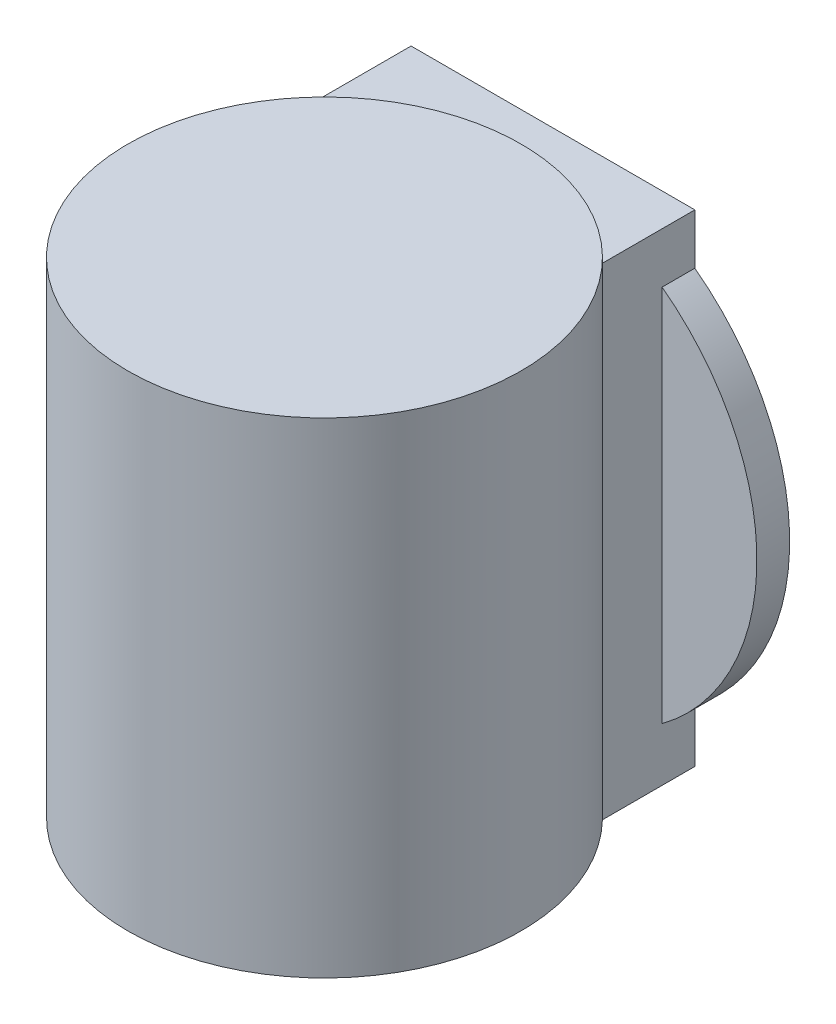
ISO-10303-21;
HEADER;
FILE_DESCRIPTION(('STEP AP214'),'2;1');
FILE_NAME('part.step','',(''),(''),'','','');
FILE_SCHEMA(('AUTOMOTIVE_DESIGN { 1 0 10303 214 1 1 1 1 }'));
ENDSEC;
DATA;
#1=APPLICATION_CONTEXT('core data for automotive mechanical design processes');
#2=APPLICATION_PROTOCOL_DEFINITION('international standard','automotive_design',2000,#1);
#3=PRODUCT_CONTEXT('',#1,'mechanical');
#4=PRODUCT('Part','Part','',(#3));
#5=PRODUCT_RELATED_PRODUCT_CATEGORY('part','',(#4));
#6=PRODUCT_DEFINITION_FORMATION('','',#4);
#7=PRODUCT_DEFINITION_CONTEXT('part definition',#1,'design');
#8=PRODUCT_DEFINITION('design','',#6,#7);
#9=PRODUCT_DEFINITION_SHAPE('','',#8);
#10=(LENGTH_UNIT() NAMED_UNIT(*) SI_UNIT(.MILLI.,.METRE.));
#11=(NAMED_UNIT(*) PLANE_ANGLE_UNIT() SI_UNIT($,.RADIAN.));
#12=(NAMED_UNIT(*) SI_UNIT($,.STERADIAN.) SOLID_ANGLE_UNIT());
#13=UNCERTAINTY_MEASURE_WITH_UNIT(LENGTH_MEASURE(1.E-05),#10,'distance_accuracy_value','');
#14=(GEOMETRIC_REPRESENTATION_CONTEXT(3) GLOBAL_UNCERTAINTY_ASSIGNED_CONTEXT((#13)) GLOBAL_UNIT_ASSIGNED_CONTEXT((#10,
#11,#12)) REPRESENTATION_CONTEXT('',''));
#15=CARTESIAN_POINT('',(0.,0.,0.));
#16=DIRECTION('',(0.,0.,1.));
#17=DIRECTION('',(1.,0.,0.));
#18=AXIS2_PLACEMENT_3D('',#15,#16,#17);
#19=CARTESIAN_POINT('',(0.,-0.037,0.));
#20=DIRECTION('',(0.,1.,0.));
#21=DIRECTION('',(0.,0.,1.));
#22=AXIS2_PLACEMENT_3D('',#19,#20,#21);
#23=CYLINDRICAL_SURFACE('',#22,0.0299907101685899);
#24=CARTESIAN_POINT('',(0.,0.037,0.));
#25=DIRECTION('',(0.,1.,0.));
#26=DIRECTION('',(0.,0.,1.));
#27=AXIS2_PLACEMENT_3D('',#24,#25,#26);
#28=CIRCLE('',#27,0.0299907101685899);
#29=CARTESIAN_POINT('',(0.,0.037,0.0299907101685899));
#30=VERTEX_POINT('',#29);
#31=EDGE_CURVE('E150',#30,#30,#28,.T.);
#32=ORIENTED_EDGE('',*,*,#31,.F.);
#33=EDGE_LOOP('',(#32));
#34=FACE_BOUND('',#33,.T.);
#35=CARTESIAN_POINT('',(0.,-0.037,0.));
#36=DIRECTION('',(0.,1.,0.));
#37=DIRECTION('',(0.,0.,1.));
#38=AXIS2_PLACEMENT_3D('',#35,#36,#37);
#39=CIRCLE('',#38,0.0299907101685899);
#40=CARTESIAN_POINT('',(-0.0217839102080584,-0.037,-0.0206131985015332));
#41=VERTEX_POINT('',#40);
#42=CARTESIAN_POINT('',(0.0215113610029221,-0.037,-0.0208974650189521));
#43=VERTEX_POINT('',#42);
#44=EDGE_CURVE('E153',#41,#43,#39,.T.);
#45=ORIENTED_EDGE('',*,*,#44,.T.);
#46=DIRECTION('',(0.,1.,0.));
#47=VECTOR('',#46,1.);
#48=CARTESIAN_POINT('',(0.0215113610029221,-0.037,-0.0208974650189521));
#49=LINE('',#48,#47);
#50=CARTESIAN_POINT('',(0.0215113610029221,0.0365490391850471,-0.0208974650189521));
#51=VERTEX_POINT('',#50);
#52=EDGE_CURVE('E148',#43,#51,#49,.T.);
#53=ORIENTED_EDGE('',*,*,#52,.T.);
#54=CARTESIAN_POINT('',(0.,0.0365490391850471,0.));
#55=DIRECTION('',(0.,1.,0.));
#56=DIRECTION('',(0.,0.,1.));
#57=AXIS2_PLACEMENT_3D('',#54,#55,#56);
#58=CIRCLE('',#57,0.0299907101685899);
#59=CARTESIAN_POINT('',(-0.0217839102080584,0.0365490391850471,-0.0206131985015332));
#60=VERTEX_POINT('',#59);
#61=EDGE_CURVE('E47',#60,#51,#58,.F.);
#62=ORIENTED_EDGE('',*,*,#61,.F.);
#63=DIRECTION('',(0.,1.,0.));
#64=VECTOR('',#63,1.);
#65=CARTESIAN_POINT('',(-0.0217839102080584,-0.037,-0.0206131985015332));
#66=LINE('',#65,#64);
#67=EDGE_CURVE('E140',#41,#60,#66,.T.);
#68=ORIENTED_EDGE('',*,*,#67,.F.);
#69=EDGE_LOOP('',(#45,#53,#62,#68));
#70=FACE_BOUND('',#69,.T.);
#71=ADVANCED_FACE('F39',(#34,#70),#23,.T.);
#72=CARTESIAN_POINT('',(0.,-0.037,0.));
#73=DIRECTION('',(0.,1.,0.));
#74=DIRECTION('',(0.,0.,1.));
#75=AXIS2_PLACEMENT_3D('',#72,#73,#74);
#76=PLANE('',#75);
#77=ORIENTED_EDGE('',*,*,#44,.F.);
#78=DIRECTION('',(0.,0.,1.));
#79=VECTOR('',#78,1.);
#80=CARTESIAN_POINT('',(-0.0217839102080584,-0.037,-0.035));
#81=LINE('',#80,#79);
#82=CARTESIAN_POINT('',(-0.0217839102080584,-0.037,-0.035));
#83=VERTEX_POINT('',#82);
#84=EDGE_CURVE('E132',#83,#41,#81,.T.);
#85=ORIENTED_EDGE('',*,*,#84,.F.);
#86=DIRECTION('',(-1.,0.,0.));
#87=VECTOR('',#86,1.);
#88=CARTESIAN_POINT('',(0.0215113610029221,-0.037,-0.035));
#89=LINE('',#88,#87);
#90=CARTESIAN_POINT('',(0.0215113610029221,-0.037,-0.035));
#91=VERTEX_POINT('',#90);
#92=EDGE_CURVE('E134',#91,#83,#89,.T.);
#93=ORIENTED_EDGE('',*,*,#92,.F.);
#94=DIRECTION('',(0.,0.,1.));
#95=VECTOR('',#94,1.);
#96=CARTESIAN_POINT('',(0.0215113610029221,-0.037,-0.035));
#97=LINE('',#96,#95);
#98=EDGE_CURVE('E141',#91,#43,#97,.T.);
#99=ORIENTED_EDGE('',*,*,#98,.T.);
#100=EDGE_LOOP('',(#77,#85,#93,#99));
#101=FACE_BOUND('',#100,.T.);
#102=ADVANCED_FACE('F164',(#101),#76,.F.);
#103=CARTESIAN_POINT('',(0.,0.037,0.));
#104=DIRECTION('',(0.,1.,0.));
#105=DIRECTION('',(0.,0.,1.));
#106=AXIS2_PLACEMENT_3D('',#103,#104,#105);
#107=PLANE('',#106);
#108=ORIENTED_EDGE('',*,*,#31,.T.);
#109=EDGE_LOOP('',(#108));
#110=FACE_BOUND('',#109,.T.);
#111=ADVANCED_FACE('F205',(#110),#107,.T.);
#112=CARTESIAN_POINT('',(0.0215113610029221,0.0365490391850471,-0.035));
#113=DIRECTION('',(0.,1.,0.));
#114=DIRECTION('',(0.,0.,1.));
#115=AXIS2_PLACEMENT_3D('',#112,#113,#114);
#116=PLANE('',#115);
#117=DIRECTION('',(0.,0.,1.));
#118=VECTOR('',#117,1.);
#119=CARTESIAN_POINT('',(-0.0217839102080584,0.0365490391850471,-0.035));
#120=LINE('',#119,#118);
#121=CARTESIAN_POINT('',(-0.0217839102080584,0.0365490391850471,-0.035));
#122=VERTEX_POINT('',#121);
#123=EDGE_CURVE('E128',#122,#60,#120,.T.);
#124=ORIENTED_EDGE('',*,*,#123,.T.);
#125=ORIENTED_EDGE('',*,*,#61,.T.);
#126=DIRECTION('',(0.,0.,1.));
#127=VECTOR('',#126,1.);
#128=CARTESIAN_POINT('',(0.0215113610029221,0.0365490391850471,-0.035));
#129=LINE('',#128,#127);
#130=CARTESIAN_POINT('',(0.0215113610029221,0.0365490391850471,-0.035));
#131=VERTEX_POINT('',#130);
#132=EDGE_CURVE('E138',#131,#51,#129,.T.);
#133=ORIENTED_EDGE('',*,*,#132,.F.);
#134=DIRECTION('',(-1.,0.,0.));
#135=VECTOR('',#134,1.);
#136=CARTESIAN_POINT('',(0.0215113610029221,0.0365490391850471,-0.035));
#137=LINE('',#136,#135);
#138=EDGE_CURVE('E127',#131,#122,#137,.T.);
#139=ORIENTED_EDGE('',*,*,#138,.T.);
#140=EDGE_LOOP('',(#124,#125,#133,#139));
#141=FACE_BOUND('',#140,.T.);
#142=ADVANCED_FACE('F157',(#141),#116,.T.);
#143=CARTESIAN_POINT('',(0.0215113610029221,0.0365490391850471,-0.035));
#144=DIRECTION('',(-1.,0.,0.));
#145=DIRECTION('',(0.,0.,1.));
#146=AXIS2_PLACEMENT_3D('',#143,#144,#145);
#147=PLANE('',#146);
#148=DIRECTION('',(0.,-1.,0.));
#149=VECTOR('',#148,1.);
#150=CARTESIAN_POINT('',(0.0215113610029221,0.0365490391850471,-0.035));
#151=LINE('',#150,#149);
#152=CARTESIAN_POINT('',(0.0215113610029221,-0.0288373710345449,-0.035));
#153=VERTEX_POINT('',#152);
#154=EDGE_CURVE('E129',#153,#91,#151,.T.);
#155=ORIENTED_EDGE('',*,*,#154,.F.);
#156=DIRECTION('',(0.,0.,1.));
#157=VECTOR('',#156,1.);
#158=CARTESIAN_POINT('',(0.0215113610029221,-0.0288373710345449,-0.035));
#159=LINE('',#158,#157);
#160=CARTESIAN_POINT('',(0.0215113610029221,-0.0288373710345449,-0.03));
#161=VERTEX_POINT('',#160);
#162=EDGE_CURVE('E107',#153,#161,#159,.T.);
#163=ORIENTED_EDGE('',*,*,#162,.T.);
#164=DIRECTION('',(0.,1.,0.));
#165=VECTOR('',#164,1.);
#166=CARTESIAN_POINT('',(0.0215113610029221,0.0365490391850471,-0.03));
#167=LINE('',#166,#165);
#168=CARTESIAN_POINT('',(0.0215113610029221,0.0288373710345449,-0.03));
#169=VERTEX_POINT('',#168);
#170=EDGE_CURVE('E120',#161,#169,#167,.T.);
#171=ORIENTED_EDGE('',*,*,#170,.T.);
#172=DIRECTION('',(0.,0.,1.));
#173=VECTOR('',#172,1.);
#174=CARTESIAN_POINT('',(0.0215113610029221,0.0288373710345449,-0.035));
#175=LINE('',#174,#173);
#176=CARTESIAN_POINT('',(0.0215113610029221,0.0288373710345449,-0.035));
#177=VERTEX_POINT('',#176);
#178=EDGE_CURVE('E104',#169,#177,#175,.F.);
#179=ORIENTED_EDGE('',*,*,#178,.T.);
#180=EDGE_CURVE('E118',#131,#177,#151,.T.);
#181=ORIENTED_EDGE('',*,*,#180,.F.);
#182=ORIENTED_EDGE('',*,*,#132,.T.);
#183=ORIENTED_EDGE('',*,*,#52,.F.);
#184=ORIENTED_EDGE('',*,*,#98,.F.);
#185=EDGE_LOOP('',(#155,#163,#171,#179,#181,#182,#183,#184));
#186=FACE_BOUND('',#185,.T.);
#187=ADVANCED_FACE('F116',(#186),#147,.F.);
#188=CARTESIAN_POINT('',(-0.0217839102080584,0.0365490391850471,-0.035));
#189=DIRECTION('',(-1.,0.,0.));
#190=DIRECTION('',(0.,0.,1.));
#191=AXIS2_PLACEMENT_3D('',#188,#189,#190);
#192=PLANE('',#191);
#193=DIRECTION('',(0.,0.,1.));
#194=VECTOR('',#193,1.);
#195=CARTESIAN_POINT('',(-0.0217839102080584,-0.028632042826688,-0.035));
#196=LINE('',#195,#194);
#197=CARTESIAN_POINT('',(-0.0217839102080584,-0.028632042826688,-0.035));
#198=VERTEX_POINT('',#197);
#199=CARTESIAN_POINT('',(-0.0217839102080584,-0.028632042826688,-0.03));
#200=VERTEX_POINT('',#199);
#201=EDGE_CURVE('E121',#198,#200,#196,.T.);
#202=ORIENTED_EDGE('',*,*,#201,.F.);
#203=DIRECTION('',(0.,-1.,0.));
#204=VECTOR('',#203,1.);
#205=CARTESIAN_POINT('',(-0.0217839102080584,0.0365490391850471,-0.035));
#206=LINE('',#205,#204);
#207=EDGE_CURVE('E168',#198,#83,#206,.T.);
#208=ORIENTED_EDGE('',*,*,#207,.T.);
#209=ORIENTED_EDGE('',*,*,#84,.T.);
#210=ORIENTED_EDGE('',*,*,#67,.T.);
#211=ORIENTED_EDGE('',*,*,#123,.F.);
#212=CARTESIAN_POINT('',(-0.0217839102080584,0.028632042826688,-0.035));
#213=VERTEX_POINT('',#212);
#214=EDGE_CURVE('E167',#122,#213,#206,.T.);
#215=ORIENTED_EDGE('',*,*,#214,.T.);
#216=DIRECTION('',(0.,0.,1.));
#217=VECTOR('',#216,1.);
#218=CARTESIAN_POINT('',(-0.0217839102080584,0.028632042826688,-0.035));
#219=LINE('',#218,#217);
#220=CARTESIAN_POINT('',(-0.0217839102080584,0.028632042826688,-0.03));
#221=VERTEX_POINT('',#220);
#222=EDGE_CURVE('E175',#221,#213,#219,.F.);
#223=ORIENTED_EDGE('',*,*,#222,.F.);
#224=DIRECTION('',(0.,1.,0.));
#225=VECTOR('',#224,1.);
#226=CARTESIAN_POINT('',(-0.0217839102080584,0.0365490391850471,-0.03));
#227=LINE('',#226,#225);
#228=EDGE_CURVE('E11',#200,#221,#227,.T.);
#229=ORIENTED_EDGE('',*,*,#228,.F.);
#230=EDGE_LOOP('',(#202,#208,#209,#210,#211,#215,#223,#229));
#231=FACE_BOUND('',#230,.T.);
#232=ADVANCED_FACE('F207',(#231),#192,.T.);
#233=CARTESIAN_POINT('',(0.,0.,-0.035));
#234=DIRECTION('',(0.,0.,1.));
#235=DIRECTION('',(1.,0.,0.));
#236=AXIS2_PLACEMENT_3D('',#233,#234,#235);
#237=PLANE('',#236);
#238=CARTESIAN_POINT('',(0.,0.,-0.035));
#239=DIRECTION('',(0.,0.,1.));
#240=DIRECTION('',(1.,0.,0.));
#241=AXIS2_PLACEMENT_3D('',#238,#239,#240);
#242=CIRCLE('',#241,0.0148606661625195);
#243=CARTESIAN_POINT('',(0.0148606661625195,0.,-0.035));
#244=VERTEX_POINT('',#243);
#245=EDGE_CURVE('E42',#244,#244,#242,.T.);
#246=ORIENTED_EDGE('',*,*,#245,.T.);
#247=EDGE_LOOP('',(#246));
#248=FACE_BOUND('',#247,.T.);
#249=ORIENTED_EDGE('',*,*,#207,.F.);
#250=CARTESIAN_POINT('',(0.,0.,-0.035));
#251=DIRECTION('',(0.,0.,1.));
#252=DIRECTION('',(1.,0.,0.));
#253=AXIS2_PLACEMENT_3D('',#250,#251,#252);
#254=CIRCLE('',#253,0.0359768344964095);
#255=EDGE_CURVE('E111',#213,#198,#254,.T.);
#256=ORIENTED_EDGE('',*,*,#255,.F.);
#257=ORIENTED_EDGE('',*,*,#214,.F.);
#258=ORIENTED_EDGE('',*,*,#138,.F.);
#259=ORIENTED_EDGE('',*,*,#180,.T.);
#260=EDGE_CURVE('E101',#153,#177,#254,.T.);
#261=ORIENTED_EDGE('',*,*,#260,.F.);
#262=ORIENTED_EDGE('',*,*,#154,.T.);
#263=ORIENTED_EDGE('',*,*,#92,.T.);
#264=EDGE_LOOP('',(#249,#256,#257,#258,#259,#261,#262,#263));
#265=FACE_BOUND('',#264,.T.);
#266=ADVANCED_FACE('F124',(#248,#265),#237,.F.);
#267=CARTESIAN_POINT('',(0.,0.,-0.03));
#268=DIRECTION('',(0.,0.,1.));
#269=DIRECTION('',(1.,0.,0.));
#270=AXIS2_PLACEMENT_3D('',#267,#268,#269);
#271=PLANE('',#270);
#272=CARTESIAN_POINT('',(0.,0.,-0.03));
#273=DIRECTION('',(0.,0.,1.));
#274=DIRECTION('',(1.,0.,0.));
#275=AXIS2_PLACEMENT_3D('',#272,#273,#274);
#276=CIRCLE('',#275,0.0359768344964095);
#277=EDGE_CURVE('E112',#221,#200,#276,.T.);
#278=ORIENTED_EDGE('',*,*,#277,.T.);
#279=ORIENTED_EDGE('',*,*,#228,.T.);
#280=EDGE_LOOP('',(#278,#279));
#281=FACE_BOUND('',#280,.T.);
#282=ADVANCED_FACE('F215',(#281),#271,.T.);
#283=CARTESIAN_POINT('',(0.,0.,-0.035));
#284=DIRECTION('',(0.,0.,1.));
#285=DIRECTION('',(1.,0.,0.));
#286=AXIS2_PLACEMENT_3D('',#283,#284,#285);
#287=CYLINDRICAL_SURFACE('',#286,0.0359768344964095);
#288=ORIENTED_EDGE('',*,*,#255,.T.);
#289=ORIENTED_EDGE('',*,*,#201,.T.);
#290=ORIENTED_EDGE('',*,*,#277,.F.);
#291=ORIENTED_EDGE('',*,*,#222,.T.);
#292=EDGE_LOOP('',(#288,#289,#290,#291));
#293=FACE_BOUND('',#292,.T.);
#294=ADVANCED_FACE('F211',(#293),#287,.T.);
#295=ORIENTED_EDGE('',*,*,#170,.F.);
#296=EDGE_CURVE('E53',#161,#169,#276,.T.);
#297=ORIENTED_EDGE('',*,*,#296,.T.);
#298=EDGE_LOOP('',(#295,#297));
#299=FACE_BOUND('',#298,.T.);
#300=ADVANCED_FACE('F218',(#299),#271,.T.);
#301=ORIENTED_EDGE('',*,*,#162,.F.);
#302=ORIENTED_EDGE('',*,*,#260,.T.);
#303=ORIENTED_EDGE('',*,*,#178,.F.);
#304=ORIENTED_EDGE('',*,*,#296,.F.);
#305=EDGE_LOOP('',(#301,#302,#303,#304));
#306=FACE_BOUND('',#305,.T.);
#307=ADVANCED_FACE('F103',(#306),#287,.T.);
#308=CARTESIAN_POINT('',(0.,0.,-0.0385));
#309=DIRECTION('',(0.,0.,1.));
#310=DIRECTION('',(1.,0.,0.));
#311=AXIS2_PLACEMENT_3D('',#308,#309,#310);
#312=CYLINDRICAL_SURFACE('',#311,0.0148606661625195);
#313=CARTESIAN_POINT('',(0.,0.,-0.0385));
#314=DIRECTION('',(0.,0.,1.));
#315=DIRECTION('',(1.,0.,0.));
#316=AXIS2_PLACEMENT_3D('',#313,#314,#315);
#317=CIRCLE('',#316,0.0148606661625195);
#318=CARTESIAN_POINT('',(0.0148606661625195,0.,-0.0385));
#319=VERTEX_POINT('',#318);
#320=EDGE_CURVE('E178',#319,#319,#317,.T.);
#321=ORIENTED_EDGE('',*,*,#320,.T.);
#322=EDGE_LOOP('',(#321));
#323=FACE_BOUND('',#322,.T.);
#324=ORIENTED_EDGE('',*,*,#245,.F.);
#325=EDGE_LOOP('',(#324));
#326=FACE_BOUND('',#325,.T.);
#327=ADVANCED_FACE('F232',(#323,#326),#312,.T.);
#328=CARTESIAN_POINT('',(0.,0.,-0.0385));
#329=DIRECTION('',(0.,0.,1.));
#330=DIRECTION('',(1.,0.,0.));
#331=AXIS2_PLACEMENT_3D('',#328,#329,#330);
#332=PLANE('',#331);
#333=CARTESIAN_POINT('',(0.,0.,-0.0385));
#334=DIRECTION('',(0.,0.,1.));
#335=DIRECTION('',(1.,0.,0.));
#336=AXIS2_PLACEMENT_3D('',#333,#334,#335);
#337=CIRCLE('',#336,0.00524821801533284);
#338=CARTESIAN_POINT('',(0.00524821801533284,0.,-0.0385));
#339=VERTEX_POINT('',#338);
#340=EDGE_CURVE('E181',#339,#339,#337,.T.);
#341=ORIENTED_EDGE('',*,*,#340,.T.);
#342=EDGE_LOOP('',(#341));
#343=FACE_BOUND('',#342,.T.);
#344=ORIENTED_EDGE('',*,*,#320,.F.);
#345=EDGE_LOOP('',(#344));
#346=FACE_BOUND('',#345,.T.);
#347=ADVANCED_FACE('F197',(#343,#346),#332,.F.);
#348=CARTESIAN_POINT('',(0.,0.,-0.043));
#349=DIRECTION('',(0.,0.,1.));
#350=DIRECTION('',(1.,0.,0.));
#351=AXIS2_PLACEMENT_3D('',#348,#349,#350);
#352=CYLINDRICAL_SURFACE('',#351,0.00524821801533284);
#353=CARTESIAN_POINT('',(0.,0.,-0.043));
#354=DIRECTION('',(0.,0.,1.));
#355=DIRECTION('',(1.,0.,0.));
#356=AXIS2_PLACEMENT_3D('',#353,#354,#355);
#357=CIRCLE('',#356,0.00524821801533284);
#358=CARTESIAN_POINT('',(0.00524821801533284,0.,-0.043));
#359=VERTEX_POINT('',#358);
#360=EDGE_CURVE('E184',#359,#359,#357,.T.);
#361=ORIENTED_EDGE('',*,*,#360,.T.);
#362=EDGE_LOOP('',(#361));
#363=FACE_BOUND('',#362,.T.);
#364=ORIENTED_EDGE('',*,*,#340,.F.);
#365=EDGE_LOOP('',(#364));
#366=FACE_BOUND('',#365,.T.);
#367=ADVANCED_FACE('F188',(#363,#366),#352,.T.);
#368=CARTESIAN_POINT('',(0.,0.,-0.043));
#369=DIRECTION('',(0.,0.,1.));
#370=DIRECTION('',(1.,0.,0.));
#371=AXIS2_PLACEMENT_3D('',#368,#369,#370);
#372=PLANE('',#371);
#373=ORIENTED_EDGE('',*,*,#360,.F.);
#374=EDGE_LOOP('',(#373));
#375=FACE_BOUND('',#374,.T.);
#376=ADVANCED_FACE('F191',(#375),#372,.F.);
#377=CLOSED_SHELL('',(#71,#102,#111,#142,#187,#232,#266,#282,#294,#300,#307,#327,#347,#367,#376));
#378=MANIFOLD_SOLID_BREP('B2',#377);
#379=ADVANCED_BREP_SHAPE_REPRESENTATION('',(#18,#378),#14);
#380=SHAPE_DEFINITION_REPRESENTATION(#9,#379);
ENDSEC;
END-ISO-10303-21;
